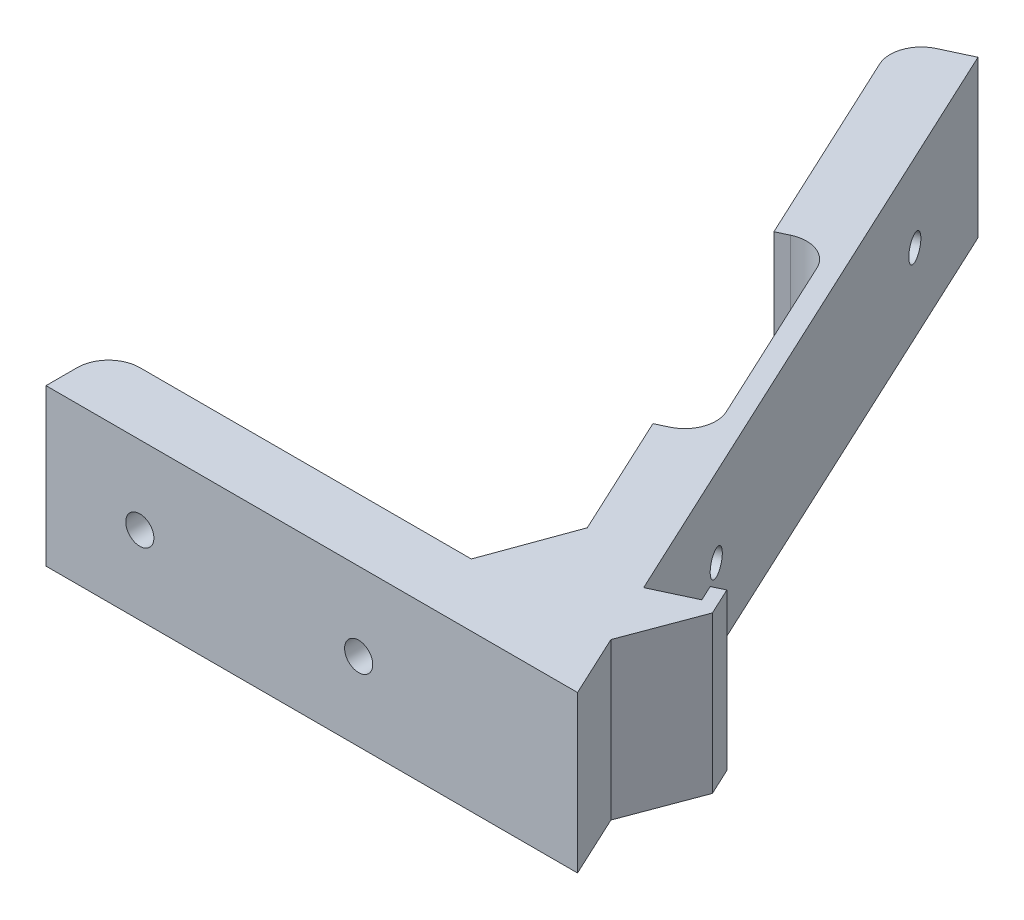
ISO-10303-21;
HEADER;
FILE_DESCRIPTION(('STEP AP214'),'2;1');
FILE_NAME('part.step','',(''),(''),'','','');
FILE_SCHEMA(('AUTOMOTIVE_DESIGN { 1 0 10303 214 1 1 1 1 }'));
ENDSEC;
DATA;
#1=APPLICATION_CONTEXT('core data for automotive mechanical design processes');
#2=APPLICATION_PROTOCOL_DEFINITION('international standard','automotive_design',2000,#1);
#3=PRODUCT_CONTEXT('',#1,'mechanical');
#4=PRODUCT('Part','Part','',(#3));
#5=PRODUCT_RELATED_PRODUCT_CATEGORY('part','',(#4));
#6=PRODUCT_DEFINITION_FORMATION('','',#4);
#7=PRODUCT_DEFINITION_CONTEXT('part definition',#1,'design');
#8=PRODUCT_DEFINITION('design','',#6,#7);
#9=PRODUCT_DEFINITION_SHAPE('','',#8);
#10=(LENGTH_UNIT() NAMED_UNIT(*) SI_UNIT(.MILLI.,.METRE.));
#11=(NAMED_UNIT(*) PLANE_ANGLE_UNIT() SI_UNIT($,.RADIAN.));
#12=(NAMED_UNIT(*) SI_UNIT($,.STERADIAN.) SOLID_ANGLE_UNIT());
#13=UNCERTAINTY_MEASURE_WITH_UNIT(LENGTH_MEASURE(1.E-05),#10,'distance_accuracy_value','');
#14=(GEOMETRIC_REPRESENTATION_CONTEXT(3) GLOBAL_UNCERTAINTY_ASSIGNED_CONTEXT((#13)) GLOBAL_UNIT_ASSIGNED_CONTEXT((#10,
#11,#12)) REPRESENTATION_CONTEXT('',''));
#15=CARTESIAN_POINT('',(0.,0.,0.));
#16=DIRECTION('',(0.,0.,1.));
#17=DIRECTION('',(1.,0.,0.));
#18=AXIS2_PLACEMENT_3D('',#15,#16,#17);
#19=CARTESIAN_POINT('',(23.0463815779207,25.,-10.7467042225469));
#20=DIRECTION('',(-0.906307787036648,0.,0.422618261740704));
#21=DIRECTION('',(0.422618261740704,0.,0.906307787036648));
#22=AXIS2_PLACEMENT_3D('',#19,#20,#21);
#23=PLANE('',#22);
#24=DIRECTION('',(-0.422618261740704,0.,-0.906307787036648));
#25=VECTOR('',#24,1.);
#26=CARTESIAN_POINT('',(23.0463815779207,25.,-10.7467042225469));
#27=LINE('',#26,#25);
#28=CARTESIAN_POINT('',(21.4616352065212,25.,-14.1452037832655));
#29=VERTEX_POINT('',#28);
#30=CARTESIAN_POINT('',(8.78308735430011,25.,-41.3344373943649));
#31=VERTEX_POINT('',#30);
#32=EDGE_CURVE('E207',#29,#31,#27,.T.);
#33=ORIENTED_EDGE('',*,*,#32,.T.);
#34=DIRECTION('',(0.,-1.,0.));
#35=VECTOR('',#34,1.);
#36=CARTESIAN_POINT('',(8.78308735430012,25.,-41.3344373943649));
#37=LINE('',#36,#35);
#38=CARTESIAN_POINT('',(8.78308735430011,0.,-41.3344373943649));
#39=VERTEX_POINT('',#38);
#40=EDGE_CURVE('E337',#31,#39,#37,.T.);
#41=ORIENTED_EDGE('',*,*,#40,.T.);
#42=DIRECTION('',(-0.422618261740704,0.,-0.906307787036648));
#43=VECTOR('',#42,1.);
#44=CARTESIAN_POINT('',(23.0463815779207,0.,-10.7467042225469));
#45=LINE('',#44,#43);
#46=CARTESIAN_POINT('',(21.4616352065212,0.,-14.1452037832655));
#47=VERTEX_POINT('',#46);
#48=EDGE_CURVE('E246',#47,#39,#45,.T.);
#49=ORIENTED_EDGE('',*,*,#48,.F.);
#50=DIRECTION('',(0.,-1.,0.));
#51=VECTOR('',#50,1.);
#52=CARTESIAN_POINT('',(21.4616352065212,25.,-14.1452037832655));
#53=LINE('',#52,#51);
#54=EDGE_CURVE('E332',#47,#29,#53,.F.);
#55=ORIENTED_EDGE('',*,*,#54,.T.);
#56=EDGE_LOOP('',(#33,#41,#49,#55));
#57=FACE_BOUND('',#56,.T.);
#58=ADVANCED_FACE('F35',(#57),#23,.T.);
#59=CARTESIAN_POINT('',(0.528344937304004,25.,1.13303937446461));
#60=DIRECTION('',(-0.422618261740704,0.,-0.906307787036648));
#61=DIRECTION('',(-0.906307787036648,0.,0.422618261740704));
#62=AXIS2_PLACEMENT_3D('',#59,#60,#61);
#63=PLANE('',#62);
#64=DIRECTION('',(0.906307787036648,0.,-0.422618261740704));
#65=VECTOR('',#64,1.);
#66=CARTESIAN_POINT('',(0.528344937304004,25.,1.13303937446461));
#67=LINE('',#66,#65);
#68=CARTESIAN_POINT('',(17.2305720059683,25.,-6.65533701589734));
#69=VERTEX_POINT('',#68);
#70=CARTESIAN_POINT('',(19.0431875800415,25.,-7.50057353937873));
#71=VERTEX_POINT('',#70);
#72=EDGE_CURVE('E183',#69,#71,#67,.T.);
#73=ORIENTED_EDGE('',*,*,#72,.T.);
#74=DIRECTION('',(0.,-1.,0.));
#75=VECTOR('',#74,1.);
#76=CARTESIAN_POINT('',(19.0431875800415,0.,-7.50057353937873));
#77=LINE('',#76,#75);
#78=CARTESIAN_POINT('',(19.0431875800415,0.,-7.50057353937873));
#79=VERTEX_POINT('',#78);
#80=EDGE_CURVE('E330',#71,#79,#77,.T.);
#81=ORIENTED_EDGE('',*,*,#80,.T.);
#82=DIRECTION('',(0.906307787036648,0.,-0.422618261740704));
#83=VECTOR('',#82,1.);
#84=CARTESIAN_POINT('',(0.528344937304004,0.,1.13303937446461));
#85=LINE('',#84,#83);
#86=CARTESIAN_POINT('',(17.2305720059683,0.,-6.65533701589734));
#87=VERTEX_POINT('',#86);
#88=EDGE_CURVE('E186',#87,#79,#85,.T.);
#89=ORIENTED_EDGE('',*,*,#88,.F.);
#90=DIRECTION('',(0.,-1.,0.));
#91=VECTOR('',#90,1.);
#92=CARTESIAN_POINT('',(17.2305720059683,25.,-6.65533701589734));
#93=LINE('',#92,#91);
#94=EDGE_CURVE('E178',#69,#87,#93,.T.);
#95=ORIENTED_EDGE('',*,*,#94,.F.);
#96=EDGE_LOOP('',(#73,#81,#89,#95));
#97=FACE_BOUND('',#96,.T.);
#98=ADVANCED_FACE('F180',(#97),#63,.T.);
#99=CARTESIAN_POINT('',(16.7022270686642,25.,-7.78837639036196));
#100=DIRECTION('',(0.906307787036648,0.,-0.422618261740704));
#101=DIRECTION('',(-0.422618261740704,0.,-0.906307787036648));
#102=AXIS2_PLACEMENT_3D('',#99,#100,#101);
#103=PLANE('',#102);
#104=CARTESIAN_POINT('',(19.9956177756755,12.5,-0.725677227234513));
#105=DIRECTION('',(0.906307787036648,0.,-0.422618261740704));
#106=DIRECTION('',(-0.422618261740704,0.,-0.906307787036648));
#107=AXIS2_PLACEMENT_3D('',#104,#105,#106);
#108=CIRCLE('',#107,2.);
#109=CARTESIAN_POINT('',(19.1503812521941,12.5,-2.53829280130781));
#110=VERTEX_POINT('',#109);
#111=EDGE_CURVE('E482',#110,#110,#108,.T.);
#112=ORIENTED_EDGE('',*,*,#111,.T.);
#113=EDGE_LOOP('',(#112));
#114=FACE_BOUND('',#113,.T.);
#115=DIRECTION('',(0.422618261740704,0.,0.906307787036648));
#116=VECTOR('',#115,1.);
#117=CARTESIAN_POINT('',(16.7022270686642,0.,-7.78837639036196));
#118=LINE('',#117,#116);
#119=CARTESIAN_POINT('',(26.4049782183934,0.,13.0192405982141));
#120=VERTEX_POINT('',#119);
#121=EDGE_CURVE('E250',#87,#120,#118,.T.);
#122=ORIENTED_EDGE('',*,*,#121,.T.);
#123=DIRECTION('',(0.,-1.,0.));
#124=VECTOR('',#123,1.);
#125=CARTESIAN_POINT('',(26.4049782183934,25.,13.0192405982141));
#126=LINE('',#125,#124);
#127=CARTESIAN_POINT('',(26.4049782183934,25.,13.0192405982141));
#128=VERTEX_POINT('',#127);
#129=EDGE_CURVE('E190',#128,#120,#126,.T.);
#130=ORIENTED_EDGE('',*,*,#129,.F.);
#131=DIRECTION('',(0.422618261740704,0.,0.906307787036648));
#132=VECTOR('',#131,1.);
#133=CARTESIAN_POINT('',(16.7022270686642,25.,-7.78837639036196));
#134=LINE('',#133,#132);
#135=EDGE_CURVE('E193',#69,#128,#134,.T.);
#136=ORIENTED_EDGE('',*,*,#135,.F.);
#137=ORIENTED_EDGE('',*,*,#94,.T.);
#138=EDGE_LOOP('',(#122,#130,#136,#137));
#139=FACE_BOUND('',#138,.T.);
#140=ADVANCED_FACE('F194',(#114,#139),#103,.F.);
#141=CARTESIAN_POINT('',(27.5004857986657,25.,10.0093582585746));
#142=DIRECTION('',(0.93969262078591,0.,0.342020143325665));
#143=DIRECTION('',(0.342020143325665,0.,-0.93969262078591));
#144=AXIS2_PLACEMENT_3D('',#141,#142,#143);
#145=PLANE('',#144);
#146=DIRECTION('',(-0.342020143325665,0.,0.93969262078591));
#147=VECTOR('',#146,1.);
#148=CARTESIAN_POINT('',(27.5004857986657,0.,10.0093582585746));
#149=LINE('',#148,#147);
#150=CARTESIAN_POINT('',(21.4569423549183,0.,26.6138574037638));
#151=VERTEX_POINT('',#150);
#152=EDGE_CURVE('E252',#120,#151,#149,.T.);
#153=ORIENTED_EDGE('',*,*,#152,.T.);
#154=DIRECTION('',(0.,-1.,0.));
#155=VECTOR('',#154,1.);
#156=CARTESIAN_POINT('',(21.4569423549183,25.,26.6138574037638));
#157=LINE('',#156,#155);
#158=CARTESIAN_POINT('',(21.4569423549183,25.,26.6138574037638));
#159=VERTEX_POINT('',#158);
#160=EDGE_CURVE('E309',#159,#151,#157,.T.);
#161=ORIENTED_EDGE('',*,*,#160,.F.);
#162=DIRECTION('',(-0.342020143325665,0.,0.93969262078591));
#163=VECTOR('',#162,1.);
#164=CARTESIAN_POINT('',(27.5004857986657,25.,10.0093582585746));
#165=LINE('',#164,#163);
#166=EDGE_CURVE('E199',#128,#159,#165,.T.);
#167=ORIENTED_EDGE('',*,*,#166,.F.);
#168=ORIENTED_EDGE('',*,*,#129,.T.);
#169=EDGE_LOOP('',(#153,#161,#167,#168));
#170=FACE_BOUND('',#169,.T.);
#171=ADVANCED_FACE('F466',(#170),#145,.F.);
#172=CARTESIAN_POINT('',(0.,25.,26.6138574037638));
#173=DIRECTION('',(0.,0.,-1.));
#174=DIRECTION('',(-1.,0.,0.));
#175=AXIS2_PLACEMENT_3D('',#172,#173,#174);
#176=PLANE('',#175);
#177=CARTESIAN_POINT('',(-21.5588920843211,12.5,26.6138574037638));
#178=DIRECTION('',(0.,0.,1.));
#179=DIRECTION('',(1.,0.,0.));
#180=AXIS2_PLACEMENT_3D('',#177,#178,#179);
#181=CIRCLE('',#180,2.25);
#182=CARTESIAN_POINT('',(-19.3088920843211,12.5,26.6138574037638));
#183=VERTEX_POINT('',#182);
#184=EDGE_CURVE('E490',#183,#183,#181,.T.);
#185=ORIENTED_EDGE('',*,*,#184,.T.);
#186=EDGE_LOOP('',(#185));
#187=FACE_BOUND('',#186,.T.);
#188=CARTESIAN_POINT('',(13.4411079156789,12.5,26.6138574037638));
#189=DIRECTION('',(0.,0.,1.));
#190=DIRECTION('',(1.,0.,0.));
#191=AXIS2_PLACEMENT_3D('',#188,#189,#190);
#192=CIRCLE('',#191,2.25);
#193=CARTESIAN_POINT('',(15.6911079156789,12.5,26.6138574037638));
#194=VERTEX_POINT('',#193);
#195=EDGE_CURVE('E497',#194,#194,#192,.T.);
#196=ORIENTED_EDGE('',*,*,#195,.T.);
#197=EDGE_LOOP('',(#196));
#198=FACE_BOUND('',#197,.T.);
#199=DIRECTION('',(1.,0.,0.));
#200=VECTOR('',#199,1.);
#201=CARTESIAN_POINT('',(0.,0.,26.6138574037638));
#202=LINE('',#201,#200);
#203=CARTESIAN_POINT('',(-31.5588920843211,0.,26.6138574037638));
#204=VERTEX_POINT('',#203);
#205=EDGE_CURVE('E256',#204,#151,#202,.T.);
#206=ORIENTED_EDGE('',*,*,#205,.F.);
#207=DIRECTION('',(0.,-1.,0.));
#208=VECTOR('',#207,1.);
#209=CARTESIAN_POINT('',(-31.5588920843211,25.,26.6138574037638));
#210=LINE('',#209,#208);
#211=CARTESIAN_POINT('',(-31.5588920843211,25.,26.6138574037638));
#212=VERTEX_POINT('',#211);
#213=EDGE_CURVE('E326',#204,#212,#210,.F.);
#214=ORIENTED_EDGE('',*,*,#213,.T.);
#215=DIRECTION('',(1.,0.,0.));
#216=VECTOR('',#215,1.);
#217=CARTESIAN_POINT('',(0.,25.,26.6138574037638));
#218=LINE('',#217,#216);
#219=EDGE_CURVE('E215',#212,#159,#218,.T.);
#220=ORIENTED_EDGE('',*,*,#219,.T.);
#221=ORIENTED_EDGE('',*,*,#160,.T.);
#222=EDGE_LOOP('',(#206,#214,#220,#221));
#223=FACE_BOUND('',#222,.T.);
#224=ADVANCED_FACE('F464',(#187,#198,#223),#176,.T.);
#225=CARTESIAN_POINT('',(-36.5588920843211,25.,0.));
#226=DIRECTION('',(-1.,0.,0.));
#227=DIRECTION('',(0.,0.,1.));
#228=AXIS2_PLACEMENT_3D('',#225,#226,#227);
#229=PLANE('',#228);
#230=DIRECTION('',(0.,0.,-1.));
#231=VECTOR('',#230,1.);
#232=CARTESIAN_POINT('',(-36.5588920843211,25.,0.));
#233=LINE('',#232,#231);
#234=CARTESIAN_POINT('',(-36.5588920843211,25.,36.6138574037638));
#235=VERTEX_POINT('',#234);
#236=CARTESIAN_POINT('',(-36.5588920843211,25.,31.6138574037638));
#237=VERTEX_POINT('',#236);
#238=EDGE_CURVE('E217',#235,#237,#233,.T.);
#239=ORIENTED_EDGE('',*,*,#238,.T.);
#240=DIRECTION('',(0.,-1.,0.));
#241=VECTOR('',#240,1.);
#242=CARTESIAN_POINT('',(-36.5588920843211,25.,31.6138574037638));
#243=LINE('',#242,#241);
#244=CARTESIAN_POINT('',(-36.5588920843211,0.,31.6138574037638));
#245=VERTEX_POINT('',#244);
#246=EDGE_CURVE('E321',#237,#245,#243,.T.);
#247=ORIENTED_EDGE('',*,*,#246,.T.);
#248=DIRECTION('',(0.,0.,-1.));
#249=VECTOR('',#248,1.);
#250=CARTESIAN_POINT('',(-36.5588920843211,0.,0.));
#251=LINE('',#250,#249);
#252=CARTESIAN_POINT('',(-36.5588920843211,0.,36.6138574037638));
#253=VERTEX_POINT('',#252);
#254=EDGE_CURVE('E258',#253,#245,#251,.T.);
#255=ORIENTED_EDGE('',*,*,#254,.F.);
#256=DIRECTION('',(0.,-1.,0.));
#257=VECTOR('',#256,1.);
#258=CARTESIAN_POINT('',(-36.5588920843211,25.,36.6138574037638));
#259=LINE('',#258,#257);
#260=EDGE_CURVE('E307',#235,#253,#259,.T.);
#261=ORIENTED_EDGE('',*,*,#260,.F.);
#262=EDGE_LOOP('',(#239,#247,#255,#261));
#263=FACE_BOUND('',#262,.T.);
#264=ADVANCED_FACE('F380',(#263),#229,.T.);
#265=CARTESIAN_POINT('',(0.,25.,36.6138574037638));
#266=DIRECTION('',(0.,0.,-1.));
#267=DIRECTION('',(-1.,0.,0.));
#268=AXIS2_PLACEMENT_3D('',#265,#266,#267);
#269=PLANE('',#268);
#270=CARTESIAN_POINT('',(-21.5588920843211,12.5,36.6138574037638));
#271=DIRECTION('',(0.,0.,1.));
#272=DIRECTION('',(1.,0.,0.));
#273=AXIS2_PLACEMENT_3D('',#270,#271,#272);
#274=CIRCLE('',#273,2.25);
#275=CARTESIAN_POINT('',(-19.3088920843211,12.5,36.6138574037638));
#276=VERTEX_POINT('',#275);
#277=EDGE_CURVE('E500',#276,#276,#274,.T.);
#278=ORIENTED_EDGE('',*,*,#277,.F.);
#279=EDGE_LOOP('',(#278));
#280=FACE_BOUND('',#279,.T.);
#281=CARTESIAN_POINT('',(13.4411079156789,12.5,36.6138574037638));
#282=DIRECTION('',(0.,0.,1.));
#283=DIRECTION('',(1.,0.,0.));
#284=AXIS2_PLACEMENT_3D('',#281,#282,#283);
#285=CIRCLE('',#284,2.25);
#286=CARTESIAN_POINT('',(15.6911079156789,12.5,36.6138574037638));
#287=VERTEX_POINT('',#286);
#288=EDGE_CURVE('E494',#287,#287,#285,.T.);
#289=ORIENTED_EDGE('',*,*,#288,.F.);
#290=EDGE_LOOP('',(#289));
#291=FACE_BOUND('',#290,.T.);
#292=DIRECTION('',(1.,0.,0.));
#293=VECTOR('',#292,1.);
#294=CARTESIAN_POINT('',(0.,0.,36.6138574037638));
#295=LINE('',#294,#293);
#296=CARTESIAN_POINT('',(48.4411079156789,0.,36.6138574037638));
#297=VERTEX_POINT('',#296);
#298=EDGE_CURVE('E261',#253,#297,#295,.T.);
#299=ORIENTED_EDGE('',*,*,#298,.T.);
#300=DIRECTION('',(0.,-1.,0.));
#301=VECTOR('',#300,1.);
#302=CARTESIAN_POINT('',(48.4411079156789,25.,36.6138574037638));
#303=LINE('',#302,#301);
#304=CARTESIAN_POINT('',(48.4411079156789,25.,36.6138574037638));
#305=VERTEX_POINT('',#304);
#306=EDGE_CURVE('E304',#305,#297,#303,.T.);
#307=ORIENTED_EDGE('',*,*,#306,.F.);
#308=DIRECTION('',(1.,0.,0.));
#309=VECTOR('',#308,1.);
#310=CARTESIAN_POINT('',(0.,25.,36.6138574037638));
#311=LINE('',#310,#309);
#312=EDGE_CURVE('E220',#235,#305,#311,.T.);
#313=ORIENTED_EDGE('',*,*,#312,.F.);
#314=ORIENTED_EDGE('',*,*,#260,.T.);
#315=EDGE_LOOP('',(#299,#307,#313,#314));
#316=FACE_BOUND('',#315,.T.);
#317=ADVANCED_FACE('F386',(#280,#291,#316),#269,.F.);
#318=CARTESIAN_POINT('',(25.7653049390307,25.,-12.014559007769));
#319=DIRECTION('',(-0.906307787036648,0.,0.422618261740704));
#320=DIRECTION('',(0.422618261740704,0.,0.906307787036648));
#321=AXIS2_PLACEMENT_3D('',#318,#319,#320);
#322=PLANE('',#321);
#323=DIRECTION('',(-0.422618261740704,0.,-0.906307787036648));
#324=VECTOR('',#323,1.);
#325=CARTESIAN_POINT('',(25.7653049390307,0.,-12.014559007769));
#326=LINE('',#325,#324);
#327=CARTESIAN_POINT('',(43.7780313341289,0.,26.6138574037638));
#328=VERTEX_POINT('',#327);
#329=EDGE_CURVE('E263',#297,#328,#326,.T.);
#330=ORIENTED_EDGE('',*,*,#329,.T.);
#331=DIRECTION('',(0.,-1.,0.));
#332=VECTOR('',#331,1.);
#333=CARTESIAN_POINT('',(43.7780313341289,25.,26.6138574037638));
#334=LINE('',#333,#332);
#335=CARTESIAN_POINT('',(43.7780313341289,25.,26.6138574037638));
#336=VERTEX_POINT('',#335);
#337=EDGE_CURVE('E302',#336,#328,#334,.T.);
#338=ORIENTED_EDGE('',*,*,#337,.F.);
#339=DIRECTION('',(-0.422618261740704,0.,-0.906307787036648));
#340=VECTOR('',#339,1.);
#341=CARTESIAN_POINT('',(25.7653049390307,25.,-12.014559007769));
#342=LINE('',#341,#340);
#343=EDGE_CURVE('E222',#305,#336,#342,.T.);
#344=ORIENTED_EDGE('',*,*,#343,.F.);
#345=ORIENTED_EDGE('',*,*,#306,.T.);
#346=EDGE_LOOP('',(#330,#338,#344,#345));
#347=FACE_BOUND('',#346,.T.);
#348=ADVANCED_FACE('F392',(#347),#322,.F.);
#349=CARTESIAN_POINT('',(47.1314543661855,25.,17.6684246460594));
#350=DIRECTION('',(0.936367517698718,0.,0.351021184259214));
#351=DIRECTION('',(0.351021184259214,0.,-0.936367517698718));
#352=AXIS2_PLACEMENT_3D('',#349,#350,#351);
#353=PLANE('',#352);
#354=DIRECTION('',(-0.351021184259214,0.,0.936367517698718));
#355=VECTOR('',#354,1.);
#356=CARTESIAN_POINT('',(47.1314543661855,0.,17.6684246460594));
#357=LINE('',#356,#355);
#358=CARTESIAN_POINT('',(48.2035405346301,0.,14.808578262645));
#359=VERTEX_POINT('',#358);
#360=EDGE_CURVE('E266',#359,#328,#357,.T.);
#361=ORIENTED_EDGE('',*,*,#360,.F.);
#362=DIRECTION('',(0.,-1.,0.));
#363=VECTOR('',#362,1.);
#364=CARTESIAN_POINT('',(48.2035405346301,25.,14.808578262645));
#365=LINE('',#364,#363);
#366=CARTESIAN_POINT('',(48.2035405346301,25.,14.808578262645));
#367=VERTEX_POINT('',#366);
#368=EDGE_CURVE('E300',#367,#359,#365,.T.);
#369=ORIENTED_EDGE('',*,*,#368,.F.);
#370=DIRECTION('',(-0.351021184259214,0.,0.936367517698718));
#371=VECTOR('',#370,1.);
#372=CARTESIAN_POINT('',(47.1314543661855,25.,17.6684246460594));
#373=LINE('',#372,#371);
#374=EDGE_CURVE('E224',#367,#336,#373,.T.);
#375=ORIENTED_EDGE('',*,*,#374,.T.);
#376=ORIENTED_EDGE('',*,*,#337,.T.);
#377=EDGE_LOOP('',(#361,#369,#375,#376));
#378=FACE_BOUND('',#377,.T.);
#379=ADVANCED_FACE('F396',(#378),#353,.T.);
#380=CARTESIAN_POINT('',(33.9220750223605,25.,-15.8181233634353));
#381=DIRECTION('',(0.906307787036647,0.,-0.422618261740705));
#382=DIRECTION('',(-0.422618261740705,0.,-0.906307787036647));
#383=AXIS2_PLACEMENT_3D('',#380,#381,#382);
#384=PLANE('',#383);
#385=DIRECTION('',(0.422618261740705,0.,0.906307787036648));
#386=VECTOR('',#385,1.);
#387=CARTESIAN_POINT('',(33.9220750223605,0.,-15.8181233634353));
#388=LINE('',#387,#386);
#389=CARTESIAN_POINT('',(46.1844211944805,0.,10.4785628643595));
#390=VERTEX_POINT('',#389);
#391=EDGE_CURVE('E269',#390,#359,#388,.T.);
#392=ORIENTED_EDGE('',*,*,#391,.F.);
#393=DIRECTION('',(0.,-1.,0.));
#394=VECTOR('',#393,1.);
#395=CARTESIAN_POINT('',(46.1844211944805,25.,10.4785628643595));
#396=LINE('',#395,#394);
#397=CARTESIAN_POINT('',(46.1844211944805,25.,10.4785628643595));
#398=VERTEX_POINT('',#397);
#399=EDGE_CURVE('E298',#398,#390,#396,.T.);
#400=ORIENTED_EDGE('',*,*,#399,.F.);
#401=DIRECTION('',(0.422618261740705,0.,0.906307787036648));
#402=VECTOR('',#401,1.);
#403=CARTESIAN_POINT('',(33.9220750223605,25.,-15.8181233634353));
#404=LINE('',#403,#402);
#405=EDGE_CURVE('E227',#398,#367,#404,.T.);
#406=ORIENTED_EDGE('',*,*,#405,.T.);
#407=ORIENTED_EDGE('',*,*,#368,.T.);
#408=EDGE_LOOP('',(#392,#400,#406,#407));
#409=FACE_BOUND('',#408,.T.);
#410=ADVANCED_FACE('F399',(#409),#384,.T.);
#411=CARTESIAN_POINT('',(12.2623461721199,25.,26.2966862277948));
#412=DIRECTION('',(0.422618261740703,0.,0.906307787036648));
#413=DIRECTION('',(0.906307787036648,0.,-0.422618261740703));
#414=AXIS2_PLACEMENT_3D('',#411,#412,#413);
#415=PLANE('',#414);
#416=DIRECTION('',(-0.906307787036648,0.,0.422618261740703));
#417=VECTOR('',#416,1.);
#418=CARTESIAN_POINT('',(12.2623461721199,0.,26.2966862277948));
#419=LINE('',#418,#417);
#420=CARTESIAN_POINT('',(44.3718056204072,0.,11.3237993878409));
#421=VERTEX_POINT('',#420);
#422=EDGE_CURVE('E272',#390,#421,#419,.T.);
#423=ORIENTED_EDGE('',*,*,#422,.T.);
#424=DIRECTION('',(0.,-1.,0.));
#425=VECTOR('',#424,1.);
#426=CARTESIAN_POINT('',(44.3718056204072,25.,11.3237993878409));
#427=LINE('',#426,#425);
#428=CARTESIAN_POINT('',(44.3718056204072,25.,11.3237993878409));
#429=VERTEX_POINT('',#428);
#430=EDGE_CURVE('E296',#429,#421,#427,.T.);
#431=ORIENTED_EDGE('',*,*,#430,.F.);
#432=DIRECTION('',(-0.906307787036648,0.,0.422618261740703));
#433=VECTOR('',#432,1.);
#434=CARTESIAN_POINT('',(12.2623461721199,25.,26.2966862277948));
#435=LINE('',#434,#433);
#436=EDGE_CURVE('E230',#398,#429,#435,.T.);
#437=ORIENTED_EDGE('',*,*,#436,.F.);
#438=ORIENTED_EDGE('',*,*,#399,.T.);
#439=EDGE_LOOP('',(#423,#431,#437,#438));
#440=FACE_BOUND('',#439,.T.);
#441=ADVANCED_FACE('F405',(#440),#415,.F.);
#442=CARTESIAN_POINT('',(32.1094594482872,25.,-14.9728868399539));
#443=DIRECTION('',(-0.906307787036648,0.,0.422618261740704));
#444=DIRECTION('',(0.422618261740704,0.,0.906307787036648));
#445=AXIS2_PLACEMENT_3D('',#442,#443,#444);
#446=PLANE('',#445);
#447=DIRECTION('',(-0.422618261740704,0.,-0.906307787036648));
#448=VECTOR('',#447,1.);
#449=CARTESIAN_POINT('',(32.1094594482872,0.,-14.9728868399539));
#450=LINE('',#449,#448);
#451=CARTESIAN_POINT('',(45.5456884370754,0.,13.8411992120531));
#452=VERTEX_POINT('',#451);
#453=EDGE_CURVE('E275',#452,#421,#450,.T.);
#454=ORIENTED_EDGE('',*,*,#453,.F.);
#455=DIRECTION('',(0.,-1.,0.));
#456=VECTOR('',#455,1.);
#457=CARTESIAN_POINT('',(45.5456884370754,25.,13.8411992120531));
#458=LINE('',#457,#456);
#459=CARTESIAN_POINT('',(45.5456884370754,25.,13.8411992120531));
#460=VERTEX_POINT('',#459);
#461=EDGE_CURVE('E294',#460,#452,#458,.T.);
#462=ORIENTED_EDGE('',*,*,#461,.F.);
#463=DIRECTION('',(-0.422618261740704,0.,-0.906307787036648));
#464=VECTOR('',#463,1.);
#465=CARTESIAN_POINT('',(32.1094594482872,25.,-14.9728868399539));
#466=LINE('',#465,#464);
#467=EDGE_CURVE('E232',#460,#429,#466,.T.);
#468=ORIENTED_EDGE('',*,*,#467,.T.);
#469=ORIENTED_EDGE('',*,*,#430,.T.);
#470=EDGE_LOOP('',(#454,#462,#468,#469));
#471=FACE_BOUND('',#470,.T.);
#472=ADVANCED_FACE('F409',(#471),#446,.T.);
#473=CARTESIAN_POINT('',(13.4362289887882,25.,28.814086052007));
#474=DIRECTION('',(-0.422618261740704,0.,-0.906307787036648));
#475=DIRECTION('',(-0.906307787036648,0.,0.422618261740704));
#476=AXIS2_PLACEMENT_3D('',#473,#474,#475);
#477=PLANE('',#476);
#478=DIRECTION('',(0.906307787036648,0.,-0.422618261740704));
#479=VECTOR('',#478,1.);
#480=CARTESIAN_POINT('',(13.4362289887882,0.,28.814086052007));
#481=LINE('',#480,#479);
#482=CARTESIAN_POINT('',(39.2015339278189,0.,16.799527044238));
#483=VERTEX_POINT('',#482);
#484=EDGE_CURVE('E278',#483,#452,#481,.T.);
#485=ORIENTED_EDGE('',*,*,#484,.F.);
#486=DIRECTION('',(0.,-1.,0.));
#487=VECTOR('',#486,1.);
#488=CARTESIAN_POINT('',(39.2015339278189,25.,16.799527044238));
#489=LINE('',#488,#487);
#490=CARTESIAN_POINT('',(39.2015339278189,25.,16.799527044238));
#491=VERTEX_POINT('',#490);
#492=EDGE_CURVE('E292',#491,#483,#489,.T.);
#493=ORIENTED_EDGE('',*,*,#492,.F.);
#494=DIRECTION('',(0.906307787036648,0.,-0.422618261740704));
#495=VECTOR('',#494,1.);
#496=CARTESIAN_POINT('',(13.4362289887882,25.,28.814086052007));
#497=LINE('',#496,#495);
#498=EDGE_CURVE('E235',#491,#460,#497,.T.);
#499=ORIENTED_EDGE('',*,*,#498,.T.);
#500=ORIENTED_EDGE('',*,*,#461,.T.);
#501=EDGE_LOOP('',(#485,#493,#499,#500));
#502=FACE_BOUND('',#501,.T.);
#503=ADVANCED_FACE('F412',(#502),#477,.T.);
#504=CARTESIAN_POINT('',(25.7653049390307,25.,-12.014559007769));
#505=DIRECTION('',(-0.906307787036648,0.,0.422618261740704));
#506=DIRECTION('',(0.422618261740704,0.,0.906307787036648));
#507=AXIS2_PLACEMENT_3D('',#504,#505,#506);
#508=PLANE('',#507);
#509=CARTESIAN_POINT('',(1.31380676276475,12.5,-64.4509660635975));
#510=DIRECTION('',(0.906307787036648,0.,-0.422618261740704));
#511=DIRECTION('',(-0.422618261740704,0.,-0.906307787036648));
#512=AXIS2_PLACEMENT_3D('',#509,#510,#511);
#513=CIRCLE('',#512,2.00000000000001);
#514=CARTESIAN_POINT('',(0.46857023928334,12.5,-66.2635816376708));
#515=VERTEX_POINT('',#514);
#516=EDGE_CURVE('E484',#515,#515,#513,.T.);
#517=ORIENTED_EDGE('',*,*,#516,.F.);
#518=EDGE_LOOP('',(#517));
#519=FACE_BOUND('',#518,.T.);
#520=CARTESIAN_POINT('',(29.058695646042,12.5,-4.95185984464155));
#521=DIRECTION('',(0.906307787036648,0.,-0.422618261740704));
#522=DIRECTION('',(-0.422618261740704,0.,-0.906307787036648));
#523=AXIS2_PLACEMENT_3D('',#520,#521,#522);
#524=CIRCLE('',#523,2.);
#525=CARTESIAN_POINT('',(28.2134591225606,12.5,-6.76447541871485));
#526=VERTEX_POINT('',#525);
#527=EDGE_CURVE('E485',#526,#526,#524,.T.);
#528=ORIENTED_EDGE('',*,*,#527,.F.);
#529=EDGE_LOOP('',(#528));
#530=FACE_BOUND('',#529,.T.);
#531=DIRECTION('',(-0.422618261740704,0.,-0.906307787036648));
#532=VECTOR('',#531,1.);
#533=CARTESIAN_POINT('',(25.7653049390307,0.,-12.014559007769));
#534=LINE('',#533,#532);
#535=CARTESIAN_POINT('',(-7.51581106292162,0.,-83.3861425962362));
#536=VERTEX_POINT('',#535);
#537=EDGE_CURVE('E281',#483,#536,#534,.T.);
#538=ORIENTED_EDGE('',*,*,#537,.T.);
#539=DIRECTION('',(0.,-1.,0.));
#540=VECTOR('',#539,1.);
#541=CARTESIAN_POINT('',(-7.51581106292162,25.,-83.3861425962362));
#542=LINE('',#541,#540);
#543=CARTESIAN_POINT('',(-7.51581106292162,25.,-83.3861425962362));
#544=VERTEX_POINT('',#543);
#545=EDGE_CURVE('E289',#544,#536,#542,.T.);
#546=ORIENTED_EDGE('',*,*,#545,.F.);
#547=DIRECTION('',(-0.422618261740704,0.,-0.906307787036648));
#548=VECTOR('',#547,1.);
#549=CARTESIAN_POINT('',(25.7653049390307,25.,-12.014559007769));
#550=LINE('',#549,#548);
#551=EDGE_CURVE('E238',#491,#544,#550,.T.);
#552=ORIENTED_EDGE('',*,*,#551,.F.);
#553=ORIENTED_EDGE('',*,*,#492,.T.);
#554=EDGE_LOOP('',(#538,#546,#552,#553));
#555=FACE_BOUND('',#554,.T.);
#556=ADVANCED_FACE('F418',(#519,#530,#555),#508,.F.);
#557=CARTESIAN_POINT('',(-33.2811160019523,25.,-71.3715835884672));
#558=DIRECTION('',(0.422618261740704,0.,0.906307787036648));
#559=DIRECTION('',(0.906307787036648,0.,-0.422618261740704));
#560=AXIS2_PLACEMENT_3D('',#557,#558,#559);
#561=PLANE('',#560);
#562=DIRECTION('',(-0.906307787036648,0.,0.422618261740704));
#563=VECTOR('',#562,1.);
#564=CARTESIAN_POINT('',(-33.2811160019523,0.,-71.3715835884672));
#565=LINE('',#564,#563);
#566=CARTESIAN_POINT('',(-12.0473499981049,0.,-81.2730512875327));
#567=VERTEX_POINT('',#566);
#568=EDGE_CURVE('E283',#536,#567,#565,.T.);
#569=ORIENTED_EDGE('',*,*,#568,.T.);
#570=DIRECTION('',(0.,-1.,0.));
#571=VECTOR('',#570,1.);
#572=CARTESIAN_POINT('',(-12.0473499981049,25.,-81.2730512875327));
#573=LINE('',#572,#571);
#574=CARTESIAN_POINT('',(-12.0473499981049,25.,-81.2730512875327));
#575=VERTEX_POINT('',#574);
#576=EDGE_CURVE('E317',#567,#575,#573,.F.);
#577=ORIENTED_EDGE('',*,*,#576,.T.);
#578=DIRECTION('',(-0.906307787036648,0.,0.422618261740704));
#579=VECTOR('',#578,1.);
#580=CARTESIAN_POINT('',(-33.2811160019523,25.,-71.3715835884672));
#581=LINE('',#580,#579);
#582=EDGE_CURVE('E240',#544,#575,#581,.T.);
#583=ORIENTED_EDGE('',*,*,#582,.F.);
#584=ORIENTED_EDGE('',*,*,#545,.T.);
#585=EDGE_LOOP('',(#569,#577,#583,#584));
#586=FACE_BOUND('',#585,.T.);
#587=ADVANCED_FACE('F422',(#586),#561,.F.);
#588=CARTESIAN_POINT('',(-7.74927110760173,12.5,-60.2247834461905));
#589=DIRECTION('',(0.906307787036648,0.,-0.422618261740704));
#590=DIRECTION('',(-0.422618261740704,0.,-0.906307787036648));
#591=AXIS2_PLACEMENT_3D('',#588,#589,#590);
#592=CIRCLE('',#591,2.00000000000001);
#593=CARTESIAN_POINT('',(-8.59450763108314,12.5,-62.0373990202637));
#594=VERTEX_POINT('',#593);
#595=EDGE_CURVE('E248',#594,#594,#592,.T.);
#596=ORIENTED_EDGE('',*,*,#595,.T.);
#597=EDGE_LOOP('',(#596));
#598=FACE_BOUND('',#597,.T.);
#599=CARTESIAN_POINT('',(-14.4657976245846,25.,-74.6284210436459));
#600=VERTEX_POINT('',#599);
#601=CARTESIAN_POINT('',(0.325841536340073,25.,-42.9076484973633));
#602=VERTEX_POINT('',#601);
#603=EDGE_CURVE('E201',#600,#602,#134,.T.);
#604=ORIENTED_EDGE('',*,*,#603,.F.);
#605=DIRECTION('',(0.,-1.,0.));
#606=VECTOR('',#605,1.);
#607=CARTESIAN_POINT('',(-14.4657976245846,25.,-74.6284210436459));
#608=LINE('',#607,#606);
#609=CARTESIAN_POINT('',(-14.4657976245846,0.,-74.6284210436459));
#610=VERTEX_POINT('',#609);
#611=EDGE_CURVE('E189',#600,#610,#608,.T.);
#612=ORIENTED_EDGE('',*,*,#611,.T.);
#613=CARTESIAN_POINT('',(0.325841536340073,0.,-42.9076484973633));
#614=VERTEX_POINT('',#613);
#615=EDGE_CURVE('E253',#610,#614,#118,.T.);
#616=ORIENTED_EDGE('',*,*,#615,.T.);
#617=DIRECTION('',(0.,-1.,0.));
#618=VECTOR('',#617,1.);
#619=CARTESIAN_POINT('',(0.325841536340073,25.,-42.9076484973633));
#620=LINE('',#619,#618);
#621=EDGE_CURVE('E245',#602,#614,#620,.T.);
#622=ORIENTED_EDGE('',*,*,#621,.F.);
#623=EDGE_LOOP('',(#604,#612,#616,#622));
#624=FACE_BOUND('',#623,.T.);
#625=ADVANCED_FACE('F428',(#598,#624),#103,.F.);
#626=CARTESIAN_POINT('',(-16.3763855323242,25.,-35.1192721070013));
#627=DIRECTION('',(-0.422618261740704,0.,-0.906307787036648));
#628=DIRECTION('',(-0.906307787036648,0.,0.422618261740704));
#629=AXIS2_PLACEMENT_3D('',#626,#627,#628);
#630=PLANE('',#629);
#631=DIRECTION('',(0.906307787036648,0.,-0.422618261740704));
#632=VECTOR('',#631,1.);
#633=CARTESIAN_POINT('',(-16.3763855323242,0.,-35.1192721070013));
#634=LINE('',#633,#632);
#635=CARTESIAN_POINT('',(2.13845711041336,0.,-43.7528850208446));
#636=VERTEX_POINT('',#635);
#637=EDGE_CURVE('E210',#614,#636,#634,.T.);
#638=ORIENTED_EDGE('',*,*,#637,.T.);
#639=DIRECTION('',(0.,-1.,0.));
#640=VECTOR('',#639,1.);
#641=CARTESIAN_POINT('',(2.13845711041336,25.,-43.7528850208446));
#642=LINE('',#641,#640);
#643=CARTESIAN_POINT('',(2.13845711041336,25.,-43.7528850208446));
#644=VERTEX_POINT('',#643);
#645=EDGE_CURVE('E50',#636,#644,#642,.F.);
#646=ORIENTED_EDGE('',*,*,#645,.T.);
#647=DIRECTION('',(0.906307787036648,0.,-0.422618261740704));
#648=VECTOR('',#647,1.);
#649=CARTESIAN_POINT('',(-16.3763855323242,25.,-35.1192721070013));
#650=LINE('',#649,#648);
#651=EDGE_CURVE('E243',#602,#644,#650,.T.);
#652=ORIENTED_EDGE('',*,*,#651,.F.);
#653=ORIENTED_EDGE('',*,*,#621,.T.);
#654=EDGE_LOOP('',(#638,#646,#652,#653));
#655=FACE_BOUND('',#654,.T.);
#656=ADVANCED_FACE('F430',(#655),#630,.F.);
#657=CARTESIAN_POINT('',(0.,25.,0.));
#658=DIRECTION('',(0.,1.,0.));
#659=DIRECTION('',(0.,0.,1.));
#660=AXIS2_PLACEMENT_3D('',#657,#658,#659);
#661=PLANE('',#660);
#662=ORIENTED_EDGE('',*,*,#219,.F.);
#663=CARTESIAN_POINT('',(-31.5588920843211,25.,31.6138574037638));
#664=DIRECTION('',(0.,1.,0.));
#665=DIRECTION('',(0.,0.,1.));
#666=AXIS2_PLACEMENT_3D('',#663,#664,#665);
#667=CIRCLE('',#666,5.);
#668=EDGE_CURVE('E328',#212,#237,#667,.T.);
#669=ORIENTED_EDGE('',*,*,#668,.T.);
#670=ORIENTED_EDGE('',*,*,#238,.F.);
#671=ORIENTED_EDGE('',*,*,#312,.T.);
#672=ORIENTED_EDGE('',*,*,#343,.T.);
#673=ORIENTED_EDGE('',*,*,#374,.F.);
#674=ORIENTED_EDGE('',*,*,#405,.F.);
#675=ORIENTED_EDGE('',*,*,#436,.T.);
#676=ORIENTED_EDGE('',*,*,#467,.F.);
#677=ORIENTED_EDGE('',*,*,#498,.F.);
#678=ORIENTED_EDGE('',*,*,#551,.T.);
#679=ORIENTED_EDGE('',*,*,#582,.T.);
#680=CARTESIAN_POINT('',(-9.93425868940134,25.,-76.7415123523494));
#681=DIRECTION('',(0.,1.,0.));
#682=DIRECTION('',(0.,0.,1.));
#683=AXIS2_PLACEMENT_3D('',#680,#681,#682);
#684=CIRCLE('',#683,5.);
#685=EDGE_CURVE('E319',#575,#600,#684,.T.);
#686=ORIENTED_EDGE('',*,*,#685,.T.);
#687=ORIENTED_EDGE('',*,*,#603,.T.);
#688=ORIENTED_EDGE('',*,*,#651,.T.);
#689=CARTESIAN_POINT('',(4.25154841911688,25.,-39.2213460856614));
#690=DIRECTION('',(0.,1.,0.));
#691=DIRECTION('',(0.,0.,1.));
#692=AXIS2_PLACEMENT_3D('',#689,#690,#691);
#693=CIRCLE('',#692,5.);
#694=EDGE_CURVE('E11',#644,#31,#693,.F.);
#695=ORIENTED_EDGE('',*,*,#694,.T.);
#696=ORIENTED_EDGE('',*,*,#32,.F.);
#697=CARTESIAN_POINT('',(16.930096271338,25.,-12.032112474562));
#698=DIRECTION('',(0.,1.,0.));
#699=DIRECTION('',(0.,0.,1.));
#700=AXIS2_PLACEMENT_3D('',#697,#698,#699);
#701=CIRCLE('',#700,5.);
#702=EDGE_CURVE('E206',#29,#71,#701,.F.);
#703=ORIENTED_EDGE('',*,*,#702,.T.);
#704=ORIENTED_EDGE('',*,*,#72,.F.);
#705=ORIENTED_EDGE('',*,*,#135,.T.);
#706=ORIENTED_EDGE('',*,*,#166,.T.);
#707=EDGE_LOOP('',(#662,#669,#670,#671,#672,#673,#674,#675,#676,#677,#678,#679,#686,#687,#688,
#695,#696,#703,#704,#705,#706));
#708=FACE_BOUND('',#707,.T.);
#709=ADVANCED_FACE('F203',(#708),#661,.T.);
#710=CARTESIAN_POINT('',(0.,0.,0.));
#711=DIRECTION('',(0.,1.,0.));
#712=DIRECTION('',(0.,0.,1.));
#713=AXIS2_PLACEMENT_3D('',#710,#711,#712);
#714=PLANE('',#713);
#715=ORIENTED_EDGE('',*,*,#254,.T.);
#716=CARTESIAN_POINT('',(-31.5588920843211,0.,31.6138574037638));
#717=DIRECTION('',(0.,1.,0.));
#718=DIRECTION('',(0.,0.,1.));
#719=AXIS2_PLACEMENT_3D('',#716,#717,#718);
#720=CIRCLE('',#719,5.);
#721=EDGE_CURVE('E324',#245,#204,#720,.F.);
#722=ORIENTED_EDGE('',*,*,#721,.T.);
#723=ORIENTED_EDGE('',*,*,#205,.T.);
#724=ORIENTED_EDGE('',*,*,#152,.F.);
#725=ORIENTED_EDGE('',*,*,#121,.F.);
#726=ORIENTED_EDGE('',*,*,#88,.T.);
#727=CARTESIAN_POINT('',(16.930096271338,0.,-12.032112474562));
#728=DIRECTION('',(0.,1.,0.));
#729=DIRECTION('',(0.,0.,1.));
#730=AXIS2_PLACEMENT_3D('',#727,#728,#729);
#731=CIRCLE('',#730,5.);
#732=EDGE_CURVE('E334',#79,#47,#731,.T.);
#733=ORIENTED_EDGE('',*,*,#732,.T.);
#734=ORIENTED_EDGE('',*,*,#48,.T.);
#735=CARTESIAN_POINT('',(4.25154841911688,0.,-39.2213460856614));
#736=DIRECTION('',(0.,1.,0.));
#737=DIRECTION('',(0.,0.,1.));
#738=AXIS2_PLACEMENT_3D('',#735,#736,#737);
#739=CIRCLE('',#738,5.);
#740=EDGE_CURVE('E43',#39,#636,#739,.T.);
#741=ORIENTED_EDGE('',*,*,#740,.T.);
#742=ORIENTED_EDGE('',*,*,#637,.F.);
#743=ORIENTED_EDGE('',*,*,#615,.F.);
#744=CARTESIAN_POINT('',(-9.93425868940134,0.,-76.7415123523494));
#745=DIRECTION('',(0.,1.,0.));
#746=DIRECTION('',(0.,0.,1.));
#747=AXIS2_PLACEMENT_3D('',#744,#745,#746);
#748=CIRCLE('',#747,5.);
#749=EDGE_CURVE('E315',#610,#567,#748,.F.);
#750=ORIENTED_EDGE('',*,*,#749,.T.);
#751=ORIENTED_EDGE('',*,*,#568,.F.);
#752=ORIENTED_EDGE('',*,*,#537,.F.);
#753=ORIENTED_EDGE('',*,*,#484,.T.);
#754=ORIENTED_EDGE('',*,*,#453,.T.);
#755=ORIENTED_EDGE('',*,*,#422,.F.);
#756=ORIENTED_EDGE('',*,*,#391,.T.);
#757=ORIENTED_EDGE('',*,*,#360,.T.);
#758=ORIENTED_EDGE('',*,*,#329,.F.);
#759=ORIENTED_EDGE('',*,*,#298,.F.);
#760=EDGE_LOOP('',(#715,#722,#723,#724,#725,#726,#733,#734,#741,#742,#743,#750,#751,#752,#753,
#754,#755,#756,#757,#758,#759));
#761=FACE_BOUND('',#760,.T.);
#762=ADVANCED_FACE('F346',(#761),#714,.F.);
#763=CARTESIAN_POINT('',(-9.93425868940134,25.,-76.7415123523494));
#764=DIRECTION('',(0.,-1.,0.));
#765=DIRECTION('',(0.,0.,-1.));
#766=AXIS2_PLACEMENT_3D('',#763,#764,#765);
#767=CYLINDRICAL_SURFACE('',#766,5.);
#768=ORIENTED_EDGE('',*,*,#685,.F.);
#769=ORIENTED_EDGE('',*,*,#576,.F.);
#770=ORIENTED_EDGE('',*,*,#749,.F.);
#771=ORIENTED_EDGE('',*,*,#611,.F.);
#772=EDGE_LOOP('',(#768,#769,#770,#771));
#773=FACE_BOUND('',#772,.T.);
#774=ADVANCED_FACE('F367',(#773),#767,.T.);
#775=CARTESIAN_POINT('',(-31.5588920843211,25.,31.6138574037638));
#776=DIRECTION('',(0.,-1.,0.));
#777=DIRECTION('',(0.,0.,-1.));
#778=AXIS2_PLACEMENT_3D('',#775,#776,#777);
#779=CYLINDRICAL_SURFACE('',#778,5.);
#780=ORIENTED_EDGE('',*,*,#668,.F.);
#781=ORIENTED_EDGE('',*,*,#213,.F.);
#782=ORIENTED_EDGE('',*,*,#721,.F.);
#783=ORIENTED_EDGE('',*,*,#246,.F.);
#784=EDGE_LOOP('',(#780,#781,#782,#783));
#785=FACE_BOUND('',#784,.T.);
#786=ADVANCED_FACE('F358',(#785),#779,.T.);
#787=CARTESIAN_POINT('',(16.930096271338,25.,-12.032112474562));
#788=DIRECTION('',(0.,1.,0.));
#789=DIRECTION('',(0.,0.,1.));
#790=AXIS2_PLACEMENT_3D('',#787,#788,#789);
#791=CYLINDRICAL_SURFACE('',#790,5.);
#792=ORIENTED_EDGE('',*,*,#702,.F.);
#793=ORIENTED_EDGE('',*,*,#54,.F.);
#794=ORIENTED_EDGE('',*,*,#732,.F.);
#795=ORIENTED_EDGE('',*,*,#80,.F.);
#796=EDGE_LOOP('',(#792,#793,#794,#795));
#797=FACE_BOUND('',#796,.T.);
#798=ADVANCED_FACE('F348',(#797),#791,.F.);
#799=CARTESIAN_POINT('',(4.25154841911688,25.,-39.2213460856614));
#800=DIRECTION('',(0.,-1.,0.));
#801=DIRECTION('',(0.,0.,-1.));
#802=AXIS2_PLACEMENT_3D('',#799,#800,#801);
#803=CYLINDRICAL_SURFACE('',#802,5.);
#804=ORIENTED_EDGE('',*,*,#694,.F.);
#805=ORIENTED_EDGE('',*,*,#645,.F.);
#806=ORIENTED_EDGE('',*,*,#740,.F.);
#807=ORIENTED_EDGE('',*,*,#40,.F.);
#808=EDGE_LOOP('',(#804,#805,#806,#807));
#809=FACE_BOUND('',#808,.T.);
#810=ADVANCED_FACE('F37',(#809),#803,.F.);
#811=CARTESIAN_POINT('',(-7.74927110760173,12.5,-60.2247834461905));
#812=DIRECTION('',(0.906307787036648,0.,-0.422618261740704));
#813=DIRECTION('',(-0.422618261740704,0.,-0.906307787036648));
#814=AXIS2_PLACEMENT_3D('',#811,#812,#813);
#815=CYLINDRICAL_SURFACE('',#814,2.00000000000001);
#816=ORIENTED_EDGE('',*,*,#595,.F.);
#817=EDGE_LOOP('',(#816));
#818=FACE_BOUND('',#817,.T.);
#819=ORIENTED_EDGE('',*,*,#516,.T.);
#820=EDGE_LOOP('',(#819));
#821=FACE_BOUND('',#820,.T.);
#822=ADVANCED_FACE('F350',(#818,#821),#815,.F.);
#823=CARTESIAN_POINT('',(19.9956177756755,12.5,-0.725677227234513));
#824=DIRECTION('',(0.906307787036648,0.,-0.422618261740704));
#825=DIRECTION('',(-0.422618261740704,0.,-0.906307787036648));
#826=AXIS2_PLACEMENT_3D('',#823,#824,#825);
#827=CYLINDRICAL_SURFACE('',#826,2.);
#828=ORIENTED_EDGE('',*,*,#111,.F.);
#829=EDGE_LOOP('',(#828));
#830=FACE_BOUND('',#829,.T.);
#831=ORIENTED_EDGE('',*,*,#527,.T.);
#832=EDGE_LOOP('',(#831));
#833=FACE_BOUND('',#832,.T.);
#834=ADVANCED_FACE('F355',(#830,#833),#827,.F.);
#835=CARTESIAN_POINT('',(13.4411079156789,12.5,26.6138574037638));
#836=DIRECTION('',(0.,0.,1.));
#837=DIRECTION('',(1.,0.,0.));
#838=AXIS2_PLACEMENT_3D('',#835,#836,#837);
#839=CYLINDRICAL_SURFACE('',#838,2.25);
#840=ORIENTED_EDGE('',*,*,#195,.F.);
#841=EDGE_LOOP('',(#840));
#842=FACE_BOUND('',#841,.T.);
#843=ORIENTED_EDGE('',*,*,#288,.T.);
#844=EDGE_LOOP('',(#843));
#845=FACE_BOUND('',#844,.T.);
#846=ADVANCED_FACE('F510',(#842,#845),#839,.F.);
#847=CARTESIAN_POINT('',(-21.5588920843211,12.5,26.6138574037638));
#848=DIRECTION('',(0.,0.,1.));
#849=DIRECTION('',(1.,0.,0.));
#850=AXIS2_PLACEMENT_3D('',#847,#848,#849);
#851=CYLINDRICAL_SURFACE('',#850,2.25);
#852=ORIENTED_EDGE('',*,*,#184,.F.);
#853=EDGE_LOOP('',(#852));
#854=FACE_BOUND('',#853,.T.);
#855=ORIENTED_EDGE('',*,*,#277,.T.);
#856=EDGE_LOOP('',(#855));
#857=FACE_BOUND('',#856,.T.);
#858=ADVANCED_FACE('F507',(#854,#857),#851,.F.);
#859=CLOSED_SHELL('',(#58,#98,#140,#171,#224,#264,#317,#348,#379,#410,#441,#472,#503,#556,#587,
#625,#656,#709,#762,#774,#786,#798,#810,#822,#834,#846,#858));
#860=MANIFOLD_SOLID_BREP('B2',#859);
#861=ADVANCED_BREP_SHAPE_REPRESENTATION('',(#18,#860),#14);
#862=SHAPE_DEFINITION_REPRESENTATION(#9,#861);
ENDSEC;
END-ISO-10303-21;
